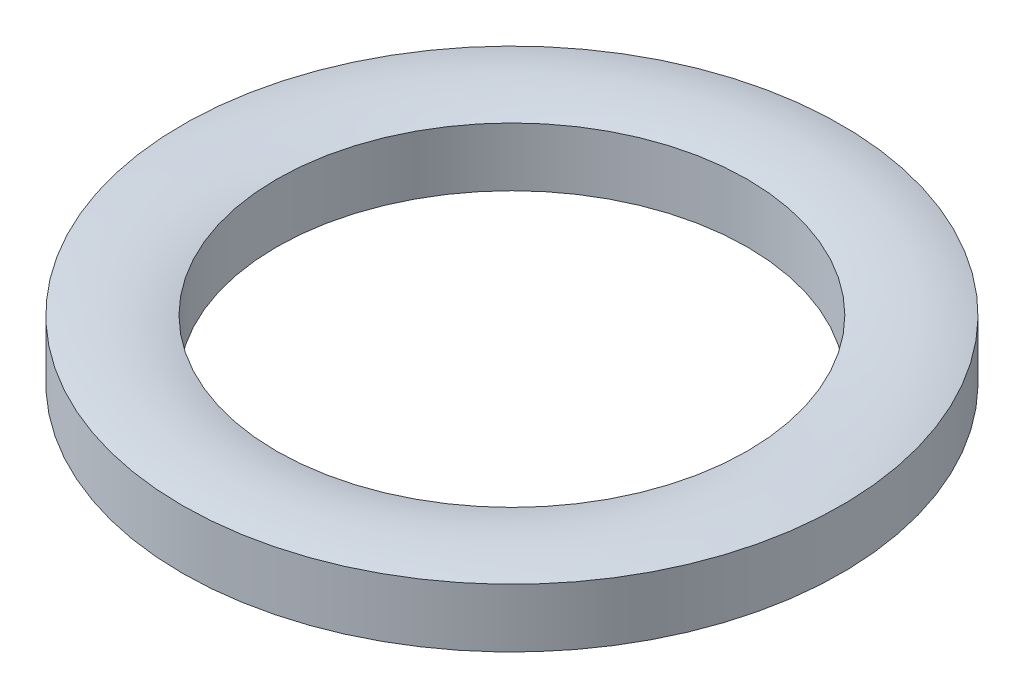
ISO-10303-21;
HEADER;
FILE_DESCRIPTION(('STEP AP214'),'2;1');
FILE_NAME('part.step','',(''),(''),'','','');
FILE_SCHEMA(('AUTOMOTIVE_DESIGN { 1 0 10303 214 1 1 1 1 }'));
ENDSEC;
DATA;
#1=APPLICATION_CONTEXT('core data for automotive mechanical design processes');
#2=APPLICATION_PROTOCOL_DEFINITION('international standard','automotive_design',2000,#1);
#3=PRODUCT_CONTEXT('',#1,'mechanical');
#4=PRODUCT('Part','Part','',(#3));
#5=PRODUCT_RELATED_PRODUCT_CATEGORY('part','',(#4));
#6=PRODUCT_DEFINITION_FORMATION('','',#4);
#7=PRODUCT_DEFINITION_CONTEXT('part definition',#1,'design');
#8=PRODUCT_DEFINITION('design','',#6,#7);
#9=PRODUCT_DEFINITION_SHAPE('','',#8);
#10=(LENGTH_UNIT() NAMED_UNIT(*) SI_UNIT(.MILLI.,.METRE.));
#11=(NAMED_UNIT(*) PLANE_ANGLE_UNIT() SI_UNIT($,.RADIAN.));
#12=(NAMED_UNIT(*) SI_UNIT($,.STERADIAN.) SOLID_ANGLE_UNIT());
#13=UNCERTAINTY_MEASURE_WITH_UNIT(LENGTH_MEASURE(1.E-05),#10,'distance_accuracy_value','');
#14=(GEOMETRIC_REPRESENTATION_CONTEXT(3) GLOBAL_UNCERTAINTY_ASSIGNED_CONTEXT((#13)) GLOBAL_UNIT_ASSIGNED_CONTEXT((#10,
#11,#12)) REPRESENTATION_CONTEXT('',''));
#15=CARTESIAN_POINT('',(0.,0.,0.));
#16=DIRECTION('',(0.,0.,1.));
#17=DIRECTION('',(1.,0.,0.));
#18=AXIS2_PLACEMENT_3D('',#15,#16,#17);
#19=CARTESIAN_POINT('',(0.,4.,0.));
#20=DIRECTION('',(0.,1.,0.));
#21=DIRECTION('',(0.,0.,1.));
#22=AXIS2_PLACEMENT_3D('',#19,#20,#21);
#23=TOROIDAL_SURFACE('',#22,6.,4.);
#24=CARTESIAN_POINT('',(0.,0.127016653792583,0.));
#25=DIRECTION('',(0.,1.,0.));
#26=DIRECTION('',(0.,0.,1.));
#27=AXIS2_PLACEMENT_3D('',#24,#25,#26);
#28=CIRCLE('',#27,7.);
#29=CARTESIAN_POINT('',(0.,0.127016653792583,7.));
#30=VERTEX_POINT('',#29);
#31=EDGE_CURVE('E10',#30,#30,#28,.T.);
#32=ORIENTED_EDGE('',*,*,#31,.F.);
#33=EDGE_LOOP('',(#32));
#34=FACE_BOUND('',#33,.T.);
#35=CARTESIAN_POINT('',(0.,0.127016653792585,0.));
#36=DIRECTION('',(0.,1.,0.));
#37=DIRECTION('',(0.,0.,1.));
#38=AXIS2_PLACEMENT_3D('',#35,#36,#37);
#39=CIRCLE('',#38,5.);
#40=CARTESIAN_POINT('',(0.,0.127016653792585,5.));
#41=VERTEX_POINT('',#40);
#42=EDGE_CURVE('E40',#41,#41,#39,.T.);
#43=ORIENTED_EDGE('',*,*,#42,.T.);
#44=EDGE_LOOP('',(#43));
#45=FACE_BOUND('',#44,.T.);
#46=ADVANCED_FACE('F26',(#34,#45),#23,.T.);
#47=CARTESIAN_POINT('',(0.,10.2160883280757,0.));
#48=DIRECTION('',(0.,1.,0.));
#49=DIRECTION('',(0.,0.,1.));
#50=AXIS2_PLACEMENT_3D('',#47,#48,#49);
#51=CYLINDRICAL_SURFACE('',#50,7.);
#52=ORIENTED_EDGE('',*,*,#31,.T.);
#53=EDGE_LOOP('',(#52));
#54=FACE_BOUND('',#53,.T.);
#55=CARTESIAN_POINT('',(0.,1.37298334620742,0.));
#56=DIRECTION('',(0.,1.,0.));
#57=DIRECTION('',(0.,0.,1.));
#58=AXIS2_PLACEMENT_3D('',#55,#56,#57);
#59=CIRCLE('',#58,7.);
#60=CARTESIAN_POINT('',(0.,1.37298334620742,7.));
#61=VERTEX_POINT('',#60);
#62=EDGE_CURVE('E32',#61,#61,#59,.T.);
#63=ORIENTED_EDGE('',*,*,#62,.F.);
#64=EDGE_LOOP('',(#63));
#65=FACE_BOUND('',#64,.T.);
#66=ADVANCED_FACE('F55',(#54,#65),#51,.T.);
#67=CARTESIAN_POINT('',(0.,-2.5,0.));
#68=DIRECTION('',(0.,1.,0.));
#69=DIRECTION('',(0.,0.,1.));
#70=AXIS2_PLACEMENT_3D('',#67,#68,#69);
#71=TOROIDAL_SURFACE('',#70,6.,4.);
#72=ORIENTED_EDGE('',*,*,#62,.T.);
#73=EDGE_LOOP('',(#72));
#74=FACE_BOUND('',#73,.T.);
#75=CARTESIAN_POINT('',(0.,1.37298334620742,0.));
#76=DIRECTION('',(0.,1.,0.));
#77=DIRECTION('',(0.,0.,1.));
#78=AXIS2_PLACEMENT_3D('',#75,#76,#77);
#79=CIRCLE('',#78,5.);
#80=CARTESIAN_POINT('',(0.,1.37298334620742,5.));
#81=VERTEX_POINT('',#80);
#82=EDGE_CURVE('E36',#81,#81,#79,.T.);
#83=ORIENTED_EDGE('',*,*,#82,.F.);
#84=EDGE_LOOP('',(#83));
#85=FACE_BOUND('',#84,.T.);
#86=ADVANCED_FACE('F49',(#74,#85),#71,.T.);
#87=CARTESIAN_POINT('',(0.,10.2160883280757,0.));
#88=DIRECTION('',(0.,1.,0.));
#89=DIRECTION('',(0.,0.,1.));
#90=AXIS2_PLACEMENT_3D('',#87,#88,#89);
#91=CYLINDRICAL_SURFACE('',#90,5.);
#92=ORIENTED_EDGE('',*,*,#82,.T.);
#93=EDGE_LOOP('',(#92));
#94=FACE_BOUND('',#93,.T.);
#95=ORIENTED_EDGE('',*,*,#42,.F.);
#96=EDGE_LOOP('',(#95));
#97=FACE_BOUND('',#96,.T.);
#98=ADVANCED_FACE('F47',(#94,#97),#91,.F.);
#99=CLOSED_SHELL('',(#46,#66,#86,#98));
#100=MANIFOLD_SOLID_BREP('B2',#99);
#101=ADVANCED_BREP_SHAPE_REPRESENTATION('',(#18,#100),#14);
#102=SHAPE_DEFINITION_REPRESENTATION(#9,#101);
ENDSEC;
END-ISO-10303-21;
